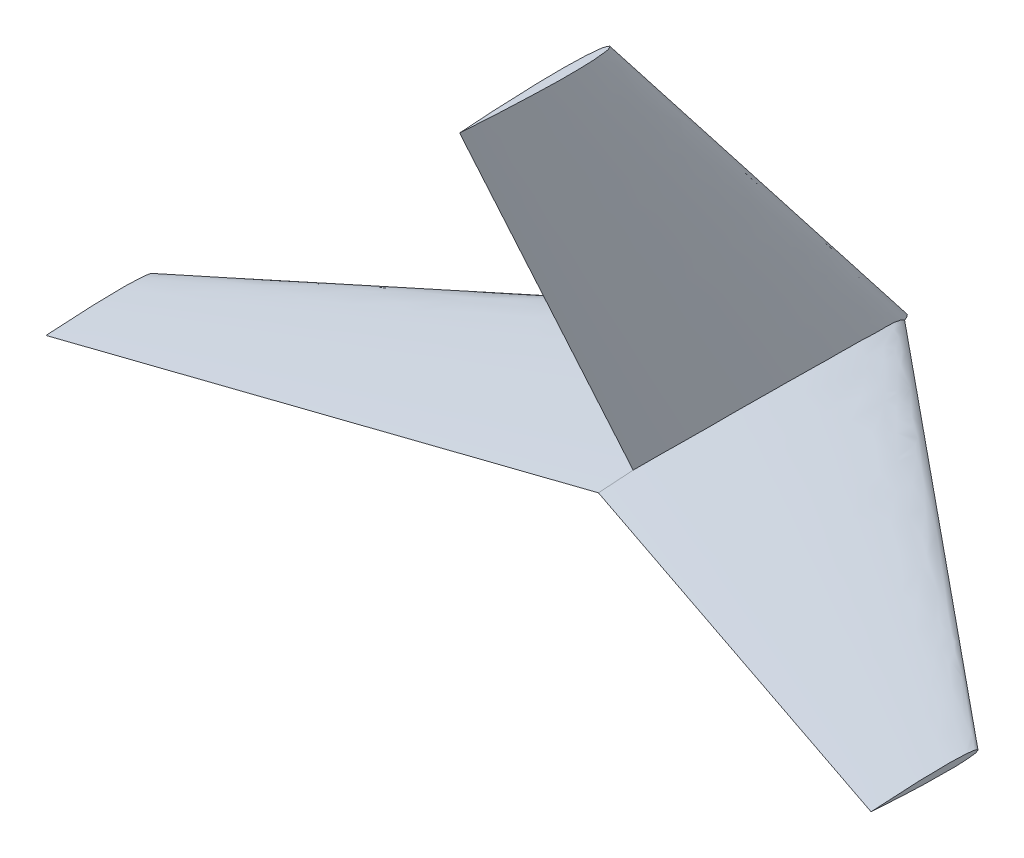
ISO-10303-21;
HEADER;
FILE_DESCRIPTION(('STEP AP214'),'2;1');
FILE_NAME('part.step','',(''),(''),'','','');
FILE_SCHEMA(('AUTOMOTIVE_DESIGN { 1 0 10303 214 1 1 1 1 }'));
ENDSEC;
DATA;
#1=APPLICATION_CONTEXT('core data for automotive mechanical design processes');
#2=APPLICATION_PROTOCOL_DEFINITION('international standard','automotive_design',2000,#1);
#3=PRODUCT_CONTEXT('',#1,'mechanical');
#4=PRODUCT('Part','Part','',(#3));
#5=PRODUCT_RELATED_PRODUCT_CATEGORY('part','',(#4));
#6=PRODUCT_DEFINITION_FORMATION('','',#4);
#7=PRODUCT_DEFINITION_CONTEXT('part definition',#1,'design');
#8=PRODUCT_DEFINITION('design','',#6,#7);
#9=PRODUCT_DEFINITION_SHAPE('','',#8);
#10=(LENGTH_UNIT() NAMED_UNIT(*) SI_UNIT(.MILLI.,.METRE.));
#11=(NAMED_UNIT(*) PLANE_ANGLE_UNIT() SI_UNIT($,.RADIAN.));
#12=(NAMED_UNIT(*) SI_UNIT($,.STERADIAN.) SOLID_ANGLE_UNIT());
#13=UNCERTAINTY_MEASURE_WITH_UNIT(LENGTH_MEASURE(1.E-05),#10,'distance_accuracy_value','');
#14=(GEOMETRIC_REPRESENTATION_CONTEXT(3) GLOBAL_UNCERTAINTY_ASSIGNED_CONTEXT((#13)) GLOBAL_UNIT_ASSIGNED_CONTEXT((#10,
#11,#12)) REPRESENTATION_CONTEXT('',''));
#15=CARTESIAN_POINT('',(0.,0.,0.));
#16=DIRECTION('',(0.,0.,1.));
#17=DIRECTION('',(1.,0.,0.));
#18=AXIS2_PLACEMENT_3D('',#15,#16,#17);
#19=CARTESIAN_POINT('',(143.375916228121,0.,2614.62639988449));
#20=DIRECTION('',(0.,1.,0.));
#21=DIRECTION('',(0.,0.,1.));
#22=AXIS2_PLACEMENT_3D('',#19,#20,#21);
#23=PLANE('',#22);
#24=CARTESIAN_POINT('',(0.,0.,-67.1064837405098));
#25=CARTESIAN_POINT('',(38.8622107668066,0.,-24.8353338561813));
#26=CARTESIAN_POINT('',(76.3641555154968,0.,58.9592027991834));
#27=CARTESIAN_POINT('',(92.8431742237743,0.,160.205111351248));
#28=CARTESIAN_POINT('',(106.469147072584,0.,251.886235017498));
#29=CARTESIAN_POINT('',(113.816795315117,0.,308.638421659881));
#30=CARTESIAN_POINT('',(121.970206556132,0.,390.595539143447));
#31=CARTESIAN_POINT('',(125.035449194138,0.,430.17457734353));
#32=CARTESIAN_POINT('',(134.952244473029,0.,562.270755544533));
#33=CARTESIAN_POINT('',(142.07101775481,0.,666.149477159571));
#34=CARTESIAN_POINT('',(151.076367101239,0.,845.00605157845));
#35=CARTESIAN_POINT('',(154.115535490917,0.,929.068005432931));
#36=CARTESIAN_POINT('',(161.252208187403,0.,1185.55672340736));
#37=CARTESIAN_POINT('',(162.798728028638,0.,1366.75073446423));
#38=CARTESIAN_POINT('',(161.967505450159,0.,1905.5600640858));
#39=CARTESIAN_POINT('',(150.288221064404,0.,2444.8644097356));
#40=CARTESIAN_POINT('',(105.609227510775,0.,3701.48037922139));
#41=CARTESIAN_POINT('',(53.3955572406963,0.,4598.67152688222));
#42=CARTESIAN_POINT('',(0.,0.,5315.73791340827));
#43=B_SPLINE_CURVE_WITH_KNOTS('',3,(#24,#25,#26,#27,#28,#29,#30,#31,#32,#33,#34,#35,#36,#37,#38,
#39,#40,#41,#42),.UNSPECIFIED.,.F.,.F.,(4,1,1,1,1,1,1,1,1,1,1,1,1,1,1,1,4),(0.,
0.0297058083328104,0.0510978464013305,0.0565096885743449,0.0809910879672366,0.0828808325251551,
0.102210307338613,0.102991506427505,0.156309200171479,0.159955320691823,0.20230384136123,
0.202945881367145,0.3022274459203,0.302769745085962,0.501714656703684,0.601305632204494,1.),.UNSPECIFIED.);
#44=CARTESIAN_POINT('',(0.,0.,5315.73791340827));
#45=VERTEX_POINT('',#44);
#46=CARTESIAN_POINT('',(0.,0.,-67.1064837405098));
#47=VERTEX_POINT('',#46);
#48=EDGE_CURVE('E108',#45,#47,#43,.F.);
#49=ORIENTED_EDGE('',*,*,#48,.F.);
#50=CARTESIAN_POINT('',(0.,0.,5315.73791340827));
#51=CARTESIAN_POINT('',(-53.3955572406954,0.,4598.67152688222));
#52=CARTESIAN_POINT('',(-105.609227510774,0.,3701.48037922139));
#53=CARTESIAN_POINT('',(-150.288221064403,0.,2444.8644097356));
#54=CARTESIAN_POINT('',(-161.967505450158,0.,1905.5600640858));
#55=CARTESIAN_POINT('',(-162.798728028637,0.,1366.75073446423));
#56=CARTESIAN_POINT('',(-161.252208187403,0.,1185.55672340736));
#57=CARTESIAN_POINT('',(-154.115535490916,0.,929.068005432931));
#58=CARTESIAN_POINT('',(-151.076367101239,0.,845.00605157845));
#59=CARTESIAN_POINT('',(-142.071017754809,0.,666.149477159571));
#60=CARTESIAN_POINT('',(-134.952244473029,0.,562.270755544533));
#61=CARTESIAN_POINT('',(-125.035449194138,0.,430.17457734353));
#62=CARTESIAN_POINT('',(-121.970206556132,0.,390.595539143447));
#63=CARTESIAN_POINT('',(-113.816795315117,0.,308.638421659881));
#64=CARTESIAN_POINT('',(-106.469147072584,0.,251.886235017498));
#65=CARTESIAN_POINT('',(-92.8431742237743,0.,160.205111351248));
#66=CARTESIAN_POINT('',(-76.3641555154968,0.,58.9592027991834));
#67=CARTESIAN_POINT('',(-38.8622107668066,0.,-24.8353338561813));
#68=CARTESIAN_POINT('',(0.,0.,-67.1064837405098));
#69=B_SPLINE_CURVE_WITH_KNOTS('',3,(#50,#51,#52,#53,#54,#55,#56,#57,#58,#59,#60,#61,#62,#63,#64,
#65,#66,#67,#68),.UNSPECIFIED.,.F.,.F.,(4,1,1,1,1,1,1,1,1,1,1,1,1,1,1,1,4),(0.,
0.398694367795506,0.498285343296316,0.697230254914038,0.6977725540797,0.797054118632855,
0.79769615863877,0.840044679308177,0.843690799828521,0.897008493572495,0.897789692661387,
0.917119167474845,0.919008912032763,0.943490311425655,0.948902153598669,0.97029419166719,1.),.UNSPECIFIED.);
#70=EDGE_CURVE('E72',#47,#45,#69,.F.);
#71=ORIENTED_EDGE('',*,*,#70,.F.);
#72=EDGE_LOOP('',(#49,#71));
#73=FACE_BOUND('',#72,.T.);
#74=ADVANCED_FACE('F69',(#73),#23,.F.);
#75=CARTESIAN_POINT('',(-77.5658627000602,7509.06793402254,7271.59948119024));
#76=DIRECTION('',(0.,1.,0.));
#77=DIRECTION('',(-1.,0.,0.));
#78=AXIS2_PLACEMENT_3D('',#75,#76,#77);
#79=PLANE('',#78);
#80=CARTESIAN_POINT('',(4.44089209850063E-13,7509.06793402254,8756.93390170189));
#81=CARTESIAN_POINT('',(-32.5278923048957,7509.06793402254,8362.74904107721));
#82=CARTESIAN_POINT('',(-53.5054302796314,7509.06793402254,7869.24601761998));
#83=CARTESIAN_POINT('',(-81.9587334886633,7509.06793402254,7178.2420495364));
#84=CARTESIAN_POINT('',(-89.4748256008597,7509.06793402254,6881.73853737439));
#85=CARTESIAN_POINT('',(-87.9088036493534,7509.06793402254,6585.50896778083));
#86=CARTESIAN_POINT('',(-85.8628578217169,7509.06793402254,6485.8915527308));
#87=CARTESIAN_POINT('',(-82.778944776583,7509.06793402254,6344.85467670777));
#88=CARTESIAN_POINT('',(-81.726749648483,7509.06793402254,6298.62780580161));
#89=CARTESIAN_POINT('',(-77.1417301573889,7509.06793402254,6200.22127169308));
#90=CARTESIAN_POINT('',(-72.8749543345173,7509.06793402254,6143.0388121138));
#91=CARTESIAN_POINT('',(-67.0596576122944,7509.06793402254,6070.58157866028));
#92=CARTESIAN_POINT('',(-65.2561569890398,7509.06793402254,6048.89513210601));
#93=CARTESIAN_POINT('',(-60.4140665043991,7509.06793402254,6003.59957020046));
#94=CARTESIAN_POINT('',(-56.1971944610726,7509.06793402254,5971.97348351821));
#95=CARTESIAN_POINT('',(-50.1539003960239,7509.06793402254,5922.81752827763));
#96=CARTESIAN_POINT('',(-41.8895400672121,7509.06793402254,5869.01802656686));
#97=CARTESIAN_POINT('',(-15.5863620162666,7509.06793402254,5810.84776595802));
#98=CARTESIAN_POINT('',(0.,7509.06793402254,5796.36948327006));
#99=B_SPLINE_CURVE_WITH_KNOTS('',3,(#80,#81,#82,#83,#84,#85,#86,#87,#88,#89,#90,#91,#92,#93,#94,
#95,#96,#97,#98),.UNSPECIFIED.,.F.,.F.,(4,1,1,1,1,1,1,1,1,1,1,1,1,1,1,1,4),(0.,
0.398694367795506,0.498285343296316,0.697230254914038,0.6977725540797,0.797054118632855,
0.79769615863877,0.840044679308177,0.843690799828521,0.897008493572495,0.897789692661387,
0.917119167474845,0.919008912032763,0.943490311425655,0.948902153598669,0.97029419166719,1.),.UNSPECIFIED.);
#100=CARTESIAN_POINT('',(4.44089209850063E-13,7509.06793402254,8756.93390170189));
#101=VERTEX_POINT('',#100);
#102=CARTESIAN_POINT('',(0.,7509.06793402254,5796.36948327006));
#103=VERTEX_POINT('',#102);
#104=EDGE_CURVE('E14',#101,#103,#99,.T.);
#105=ORIENTED_EDGE('',*,*,#104,.F.);
#106=CARTESIAN_POINT('',(0.,7509.06793402254,5796.36948327006));
#107=CARTESIAN_POINT('',(15.5863620162666,7509.06793402254,5810.84776595802));
#108=CARTESIAN_POINT('',(41.8895400672126,7509.06793402254,5869.01802656685));
#109=CARTESIAN_POINT('',(50.1539003960239,7509.06793402254,5922.81752827763));
#110=CARTESIAN_POINT('',(56.1971944610726,7509.06793402254,5971.97348351821));
#111=CARTESIAN_POINT('',(60.4140665043991,7509.06793402254,6003.59957020046));
#112=CARTESIAN_POINT('',(65.2561569890402,7509.06793402254,6048.89513210601));
#113=CARTESIAN_POINT('',(67.0596576122944,7509.06793402254,6070.58157866028));
#114=CARTESIAN_POINT('',(72.8749543345177,7509.06793402254,6143.0388121138));
#115=CARTESIAN_POINT('',(77.1417301573893,7509.06793402254,6200.22127169308));
#116=CARTESIAN_POINT('',(81.7267496484835,7509.06793402254,6298.62780580161));
#117=CARTESIAN_POINT('',(82.778944776583,7509.06793402254,6344.85467670776));
#118=CARTESIAN_POINT('',(85.8628578217169,7509.06793402254,6485.8915527308));
#119=CARTESIAN_POINT('',(87.9088036493538,7509.06793402254,6585.50896778083));
#120=CARTESIAN_POINT('',(89.4748256008602,7509.06793402254,6881.73853737439));
#121=CARTESIAN_POINT('',(81.9587334886642,7509.06793402254,7178.2420495364));
#122=CARTESIAN_POINT('',(53.5054302796318,7509.06793402254,7869.24601761998));
#123=CARTESIAN_POINT('',(32.5278923048962,7509.06793402254,8362.74904107721));
#124=CARTESIAN_POINT('',(4.44089209850063E-13,7509.06793402254,8756.93390170189));
#125=B_SPLINE_CURVE_WITH_KNOTS('',3,(#106,#107,#108,#109,#110,#111,#112,#113,#114,#115,#116,
#117,#118,#119,#120,#121,#122,#123,#124),.UNSPECIFIED.,.F.,.F.,(4,1,1,1,1,1,1,1,1,1,1,1,1,1,1,1,
4),(0.,0.0297058083328104,0.0510978464013305,0.0565096885743449,0.0809910879672366,
0.0828808325251551,0.102210307338613,0.102991506427505,0.156309200171479,0.159955320691823,
0.20230384136123,0.202945881367145,0.3022274459203,0.302769745085962,0.501714656703684,
0.601305632204494,1.),.UNSPECIFIED.);
#126=EDGE_CURVE('E94',#103,#101,#125,.T.);
#127=ORIENTED_EDGE('',*,*,#126,.F.);
#128=EDGE_LOOP('',(#105,#127));
#129=FACE_BOUND('',#128,.T.);
#130=ADVANCED_FACE('F95',(#129),#79,.T.);
#131=CARTESIAN_POINT('',(4.44089209850063E-13,7509.06793402254,8756.93390170189));
#132=CARTESIAN_POINT('',(0.,0.,5315.73791340827));
#133=CARTESIAN_POINT('',(-32.5278923048957,7509.06793402254,8362.74904107721));
#134=CARTESIAN_POINT('',(-53.3955572406954,0.,4598.67152688222));
#135=CARTESIAN_POINT('',(-53.5054302796314,7509.06793402254,7869.24601761998));
#136=CARTESIAN_POINT('',(-105.609227510774,0.,3701.48037922139));
#137=CARTESIAN_POINT('',(-81.9587334886633,7509.06793402254,7178.2420495364));
#138=CARTESIAN_POINT('',(-150.288221064403,0.,2444.8644097356));
#139=CARTESIAN_POINT('',(-89.4748256008597,7509.06793402254,6881.73853737439));
#140=CARTESIAN_POINT('',(-161.967505450158,0.,1905.5600640858));
#141=CARTESIAN_POINT('',(-87.9088036493534,7509.06793402254,6585.50896778083));
#142=CARTESIAN_POINT('',(-162.798728028637,0.,1366.75073446423));
#143=CARTESIAN_POINT('',(-85.8628578217169,7509.06793402254,6485.8915527308));
#144=CARTESIAN_POINT('',(-161.252208187403,0.,1185.55672340736));
#145=CARTESIAN_POINT('',(-82.778944776583,7509.06793402254,6344.85467670777));
#146=CARTESIAN_POINT('',(-154.115535490916,0.,929.068005432931));
#147=CARTESIAN_POINT('',(-81.726749648483,7509.06793402254,6298.62780580161));
#148=CARTESIAN_POINT('',(-151.076367101239,0.,845.00605157845));
#149=CARTESIAN_POINT('',(-77.1417301573889,7509.06793402254,6200.22127169308));
#150=CARTESIAN_POINT('',(-142.071017754809,0.,666.149477159571));
#151=CARTESIAN_POINT('',(-72.8749543345173,7509.06793402254,6143.0388121138));
#152=CARTESIAN_POINT('',(-134.952244473029,0.,562.270755544533));
#153=CARTESIAN_POINT('',(-67.0596576122944,7509.06793402254,6070.58157866028));
#154=CARTESIAN_POINT('',(-125.035449194138,0.,430.17457734353));
#155=CARTESIAN_POINT('',(-65.2561569890398,7509.06793402254,6048.89513210601));
#156=CARTESIAN_POINT('',(-121.970206556132,0.,390.595539143447));
#157=CARTESIAN_POINT('',(-60.4140665043991,7509.06793402254,6003.59957020046));
#158=CARTESIAN_POINT('',(-113.816795315117,0.,308.638421659881));
#159=CARTESIAN_POINT('',(-56.1971944610726,7509.06793402254,5971.97348351821));
#160=CARTESIAN_POINT('',(-106.469147072584,0.,251.886235017498));
#161=CARTESIAN_POINT('',(-50.1539003960239,7509.06793402254,5922.81752827763));
#162=CARTESIAN_POINT('',(-92.8431742237743,0.,160.205111351248));
#163=CARTESIAN_POINT('',(-41.8895400672121,7509.06793402254,5869.01802656686));
#164=CARTESIAN_POINT('',(-76.3641555154968,0.,58.9592027991834));
#165=CARTESIAN_POINT('',(-15.5863620162666,7509.06793402254,5810.84776595802));
#166=CARTESIAN_POINT('',(-38.8622107668066,0.,-24.8353338561813));
#167=CARTESIAN_POINT('',(0.,7509.06793402254,5796.36948327006));
#168=CARTESIAN_POINT('',(0.,0.,-67.1064837405098));
#169=B_SPLINE_SURFACE_WITH_KNOTS('',3,1,((#131,#132),(#133,#134),(#135,#136),(#137,#138),(#139,
#140),(#141,#142),(#143,#144),(#145,#146),(#147,#148),(#149,#150),(#151,#152),(#153,#154),(#155,
#156),(#157,#158),(#159,#160),(#161,#162),(#163,#164),(#165,#166),(#167,#168)),.UNSPECIFIED.,
.F.,.F.,.F.,(4,1,1,1,1,1,1,1,1,1,1,1,1,1,1,1,4),(2,2),(0.,0.398694367795506,0.498285343296316,
0.697230254914038,0.6977725540797,0.797054118632855,0.79769615863877,0.840044679308177,
0.843690799828521,0.897008493572495,0.897789692661387,0.917119167474845,0.919008912032763,
0.943490311425655,0.948902153598669,0.97029419166719,1.),(0.,1.),.UNSPECIFIED.);
#170=DIRECTION('',(0.,0.788176268628742,0.615449567040609));
#171=VECTOR('',#170,1.);
#172=CARTESIAN_POINT('',(0.,3754.53396701127,2864.63149976478));
#173=LINE('',#172,#171);
#174=EDGE_CURVE('E106',#47,#103,#173,.T.);
#175=DIRECTION('',(0.,-0.909085921983997,-0.416608673038028));
#176=VECTOR('',#175,1.);
#177=CARTESIAN_POINT('',(0.,3754.53396701127,7036.33590755508));
#178=LINE('',#177,#176);
#179=EDGE_CURVE('E101',#101,#45,#178,.T.);
#180=ORIENTED_EDGE('',*,*,#104,.T.);
#181=ORIENTED_EDGE('',*,*,#174,.F.);
#182=ORIENTED_EDGE('',*,*,#70,.T.);
#183=ORIENTED_EDGE('',*,*,#179,.F.);
#184=EDGE_LOOP('',(#180,#181,#182,#183));
#185=FACE_BOUND('',#184,.T.);
#186=ADVANCED_FACE('F105',(#185),#169,.T.);
#187=CARTESIAN_POINT('',(0.,7509.06793402254,5796.36948327006));
#188=CARTESIAN_POINT('',(0.,0.,-67.1064837405098));
#189=CARTESIAN_POINT('',(15.5863620162666,7509.06793402254,5810.84776595802));
#190=CARTESIAN_POINT('',(38.8622107668066,0.,-24.8353338561813));
#191=CARTESIAN_POINT('',(41.8895400672126,7509.06793402254,5869.01802656685));
#192=CARTESIAN_POINT('',(76.3641555154968,0.,58.9592027991834));
#193=CARTESIAN_POINT('',(50.1539003960239,7509.06793402254,5922.81752827763));
#194=CARTESIAN_POINT('',(92.8431742237743,0.,160.205111351248));
#195=CARTESIAN_POINT('',(56.1971944610726,7509.06793402254,5971.97348351821));
#196=CARTESIAN_POINT('',(106.469147072584,0.,251.886235017498));
#197=CARTESIAN_POINT('',(60.4140665043991,7509.06793402254,6003.59957020046));
#198=CARTESIAN_POINT('',(113.816795315117,0.,308.638421659881));
#199=CARTESIAN_POINT('',(65.2561569890402,7509.06793402254,6048.89513210601));
#200=CARTESIAN_POINT('',(121.970206556132,0.,390.595539143447));
#201=CARTESIAN_POINT('',(67.0596576122944,7509.06793402254,6070.58157866028));
#202=CARTESIAN_POINT('',(125.035449194138,0.,430.17457734353));
#203=CARTESIAN_POINT('',(72.8749543345177,7509.06793402254,6143.0388121138));
#204=CARTESIAN_POINT('',(134.952244473029,0.,562.270755544533));
#205=CARTESIAN_POINT('',(77.1417301573893,7509.06793402254,6200.22127169308));
#206=CARTESIAN_POINT('',(142.07101775481,0.,666.149477159571));
#207=CARTESIAN_POINT('',(81.7267496484835,7509.06793402254,6298.62780580161));
#208=CARTESIAN_POINT('',(151.076367101239,0.,845.00605157845));
#209=CARTESIAN_POINT('',(82.778944776583,7509.06793402254,6344.85467670776));
#210=CARTESIAN_POINT('',(154.115535490917,0.,929.068005432931));
#211=CARTESIAN_POINT('',(85.8628578217169,7509.06793402254,6485.8915527308));
#212=CARTESIAN_POINT('',(161.252208187403,0.,1185.55672340736));
#213=CARTESIAN_POINT('',(87.9088036493538,7509.06793402254,6585.50896778083));
#214=CARTESIAN_POINT('',(162.798728028638,0.,1366.75073446423));
#215=CARTESIAN_POINT('',(89.4748256008602,7509.06793402254,6881.73853737439));
#216=CARTESIAN_POINT('',(161.967505450159,0.,1905.5600640858));
#217=CARTESIAN_POINT('',(81.9587334886642,7509.06793402254,7178.2420495364));
#218=CARTESIAN_POINT('',(150.288221064404,0.,2444.8644097356));
#219=CARTESIAN_POINT('',(53.5054302796318,7509.06793402254,7869.24601761998));
#220=CARTESIAN_POINT('',(105.609227510775,0.,3701.48037922139));
#221=CARTESIAN_POINT('',(32.5278923048962,7509.06793402254,8362.74904107721));
#222=CARTESIAN_POINT('',(53.3955572406963,0.,4598.67152688222));
#223=CARTESIAN_POINT('',(4.44089209850063E-13,7509.06793402254,8756.93390170189));
#224=CARTESIAN_POINT('',(0.,0.,5315.73791340827));
#225=B_SPLINE_SURFACE_WITH_KNOTS('',3,1,((#187,#188),(#189,#190),(#191,#192),(#193,#194),(#195,
#196),(#197,#198),(#199,#200),(#201,#202),(#203,#204),(#205,#206),(#207,#208),(#209,#210),(#211,
#212),(#213,#214),(#215,#216),(#217,#218),(#219,#220),(#221,#222),(#223,#224)),.UNSPECIFIED.,
.F.,.F.,.F.,(4,1,1,1,1,1,1,1,1,1,1,1,1,1,1,1,4),(2,2),(0.,0.0297058083328104,0.0510978464013305,
0.0565096885743449,0.0809910879672366,0.0828808325251551,0.102210307338613,0.102991506427505,
0.156309200171479,0.159955320691823,0.20230384136123,0.202945881367145,0.3022274459203,
0.302769745085962,0.501714656703684,0.601305632204494,1.),(0.,1.),.UNSPECIFIED.);
#226=ORIENTED_EDGE('',*,*,#126,.T.);
#227=ORIENTED_EDGE('',*,*,#179,.T.);
#228=ORIENTED_EDGE('',*,*,#48,.T.);
#229=ORIENTED_EDGE('',*,*,#174,.T.);
#230=EDGE_LOOP('',(#226,#227,#228,#229));
#231=FACE_BOUND('',#230,.T.);
#232=ADVANCED_FACE('F107',(#231),#225,.T.);
#233=CLOSED_SHELL('',(#74,#130,#186,#232));
#234=MANIFOLD_SOLID_BREP('B2',#233);
#235=CARTESIAN_POINT('',(8129.32474719149,54.9994394448174,7720.83097549307));
#236=DIRECTION('',(-1.,0.,0.));
#237=DIRECTION('',(0.,0.,-1.));
#238=AXIS2_PLACEMENT_3D('',#235,#236,#237);
#239=PLANE('',#238);
#240=CARTESIAN_POINT('',(8129.32474719149,-4.44089209850063E-13,8778.34701145353));
#241=CARTESIAN_POINT('',(8129.32474719149,13.4689535346464,8567.79107372927));
#242=CARTESIAN_POINT('',(8129.32474719149,35.7745448107063,8216.72224519072));
#243=CARTESIAN_POINT('',(8129.32474719149,50.8000343743578,7865.22228500027));
#244=CARTESIAN_POINT('',(8129.32474719149,58.9672063252578,7584.43475676211));
#245=CARTESIAN_POINT('',(8129.32474719149,61.1467978209106,7443.692333661));
#246=CARTESIAN_POINT('',(8129.32474719149,62.2292931475541,7232.92916361684));
#247=CARTESIAN_POINT('',(8129.32474719149,62.2128927212469,7162.30727948896));
#248=CARTESIAN_POINT('',(8129.32474719149,59.0292367567256,7059.23223622224));
#249=CARTESIAN_POINT('',(8129.32474719149,57.3568159019948,7022.34378664667));
#250=CARTESIAN_POINT('',(8129.32474719149,53.4838626971883,6951.9195742344));
#251=CARTESIAN_POINT('',(8129.32474719149,51.0268210130049,6914.31299621902));
#252=CARTESIAN_POINT('',(8129.32474719149,47.1229848342181,6864.58810519034));
#253=CARTESIAN_POINT('',(8129.32474719149,45.6806839170984,6847.61853535539));
#254=CARTESIAN_POINT('',(8129.32474719149,42.0327102210813,6814.79063567584));
#255=CARTESIAN_POINT('',(8129.32474719149,39.4990681574887,6796.55240807656));
#256=CARTESIAN_POINT('',(8129.32474719149,32.2228985029138,6740.84151167535));
#257=CARTESIAN_POINT('',(8129.32474719149,27.9357117117254,6700.23471062862));
#258=CARTESIAN_POINT('',(8129.32474719149,0.,6670.7442992187));
#259=B_SPLINE_CURVE_WITH_KNOTS('',3,(#240,#241,#242,#243,#244,#245,#246,#247,#248,#249,#250,
#251,#252,#253,#254,#255,#256,#257,#258),.UNSPECIFIED.,.F.,.F.,(4,1,1,1,1,1,1,1,1,1,1,1,1,1,1,1,
4),(0.,0.298931815970666,0.498152968932551,0.498299211220126,0.696834066796413,
0.697522121171649,0.796796462208503,0.796844070583475,0.843589068570306,0.849087559843308,
0.896763932817385,0.896989321780881,0.919683005075993,0.920855221312245,0.943853286653914,
0.94587432595104,1.),.UNSPECIFIED.);
#260=CARTESIAN_POINT('',(8129.32474719149,0.,6670.7442992187));
#261=VERTEX_POINT('',#260);
#262=CARTESIAN_POINT('',(8129.32474719149,-4.44089209850063E-13,8778.34701145353));
#263=VERTEX_POINT('',#262);
#264=EDGE_CURVE('E271',#261,#263,#259,.F.);
#265=ORIENTED_EDGE('',*,*,#264,.T.);
#266=CARTESIAN_POINT('',(8129.32474719149,0.,6670.7442992187));
#267=CARTESIAN_POINT('',(8129.32474719149,-27.9357117117254,6700.23471062863));
#268=CARTESIAN_POINT('',(8129.32474719149,-32.2228985029143,6740.84151167535));
#269=CARTESIAN_POINT('',(8129.32474719149,-39.4990681574892,6796.55240807656));
#270=CARTESIAN_POINT('',(8129.32474719149,-42.0327102210818,6814.79063567584));
#271=CARTESIAN_POINT('',(8129.32474719149,-45.6806839170989,6847.61853535539));
#272=CARTESIAN_POINT('',(8129.32474719149,-47.1229848342185,6864.58810519033));
#273=CARTESIAN_POINT('',(8129.32474719149,-51.0268210130054,6914.31299621902));
#274=CARTESIAN_POINT('',(8129.32474719149,-53.4838626971883,6951.9195742344));
#275=CARTESIAN_POINT('',(8129.32474719149,-57.3568159019953,7022.34378664667));
#276=CARTESIAN_POINT('',(8129.32474719149,-59.029236756726,7059.23223622224));
#277=CARTESIAN_POINT('',(8129.32474719149,-62.2128927212469,7162.30727948896));
#278=CARTESIAN_POINT('',(8129.32474719149,-62.2292931475545,7232.92916361684));
#279=CARTESIAN_POINT('',(8129.32474719149,-61.146797820911,7443.69233366099));
#280=CARTESIAN_POINT('',(8129.32474719149,-58.9672063252586,7584.43475676211));
#281=CARTESIAN_POINT('',(8129.32474719149,-50.8000343743582,7865.22228500027));
#282=CARTESIAN_POINT('',(8129.32474719149,-35.7745448107067,8216.72224519072));
#283=CARTESIAN_POINT('',(8129.32474719149,-13.4689535346473,8567.79107372928));
#284=CARTESIAN_POINT('',(8129.32474719149,-4.44089209850063E-13,8778.34701145353));
#285=B_SPLINE_CURVE_WITH_KNOTS('',3,(#266,#267,#268,#269,#270,#271,#272,#273,#274,#275,#276,
#277,#278,#279,#280,#281,#282,#283,#284),.UNSPECIFIED.,.F.,.F.,(4,1,1,1,1,1,1,1,1,1,1,1,1,1,1,1,
4),(0.,0.0541256740489601,0.0561467133460857,0.0791447786877554,0.0803169949240068,
0.103010678219119,0.103236067182615,0.150912440156692,0.156410931429694,0.203155929416525,
0.203203537791497,0.302477878828351,0.303165933203587,0.501700788779874,0.501847031067449,
0.701068184029334,1.),.UNSPECIFIED.);
#286=EDGE_CURVE('E302',#263,#261,#285,.F.);
#287=ORIENTED_EDGE('',*,*,#286,.T.);
#288=EDGE_LOOP('',(#265,#287));
#289=FACE_BOUND('',#288,.T.);
#290=ADVANCED_FACE('F268',(#289),#239,.F.);
#291=CARTESIAN_POINT('',(-8129.32474719149,54.9994394448174,7720.83097549307));
#292=DIRECTION('',(1.,0.,0.));
#293=DIRECTION('',(0.,0.,-1.));
#294=AXIS2_PLACEMENT_3D('',#291,#292,#293);
#295=PLANE('',#294);
#296=CARTESIAN_POINT('',(-8129.32474719149,-4.44089209850063E-13,8778.34701145353));
#297=CARTESIAN_POINT('',(-8129.32474719149,13.4689535346464,8567.79107372927));
#298=CARTESIAN_POINT('',(-8129.32474719149,35.7745448107063,8216.72224519072));
#299=CARTESIAN_POINT('',(-8129.32474719149,50.8000343743578,7865.22228500027));
#300=CARTESIAN_POINT('',(-8129.32474719149,58.9672063252578,7584.43475676211));
#301=CARTESIAN_POINT('',(-8129.32474719149,61.1467978209106,7443.692333661));
#302=CARTESIAN_POINT('',(-8129.32474719149,62.2292931475541,7232.92916361684));
#303=CARTESIAN_POINT('',(-8129.32474719149,62.2128927212469,7162.30727948896));
#304=CARTESIAN_POINT('',(-8129.32474719149,59.0292367567256,7059.23223622224));
#305=CARTESIAN_POINT('',(-8129.32474719149,57.3568159019948,7022.34378664667));
#306=CARTESIAN_POINT('',(-8129.32474719149,53.4838626971883,6951.9195742344));
#307=CARTESIAN_POINT('',(-8129.32474719149,51.0268210130049,6914.31299621902));
#308=CARTESIAN_POINT('',(-8129.32474719149,47.1229848342181,6864.58810519034));
#309=CARTESIAN_POINT('',(-8129.32474719149,45.6806839170984,6847.61853535539));
#310=CARTESIAN_POINT('',(-8129.32474719149,42.0327102210813,6814.79063567584));
#311=CARTESIAN_POINT('',(-8129.32474719149,39.4990681574887,6796.55240807656));
#312=CARTESIAN_POINT('',(-8129.32474719149,32.2228985029138,6740.84151167535));
#313=CARTESIAN_POINT('',(-8129.32474719149,27.9357117117254,6700.23471062862));
#314=CARTESIAN_POINT('',(-8129.32474719149,0.,6670.7442992187));
#315=B_SPLINE_CURVE_WITH_KNOTS('',3,(#296,#297,#298,#299,#300,#301,#302,#303,#304,#305,#306,
#307,#308,#309,#310,#311,#312,#313,#314),.UNSPECIFIED.,.F.,.F.,(4,1,1,1,1,1,1,1,1,1,1,1,1,1,1,1,
4),(0.,0.298931815970666,0.498152968932551,0.498299211220126,0.696834066796413,
0.697522121171649,0.796796462208503,0.796844070583475,0.843589068570306,0.849087559843308,
0.896763932817385,0.896989321780881,0.919683005075993,0.920855221312245,0.943853286653914,
0.94587432595104,1.),.UNSPECIFIED.);
#316=CARTESIAN_POINT('',(-8129.32474719149,0.,6670.7442992187));
#317=VERTEX_POINT('',#316);
#318=CARTESIAN_POINT('',(-8129.32474719149,-4.44089209850063E-13,8778.34701145353));
#319=VERTEX_POINT('',#318);
#320=EDGE_CURVE('E280',#317,#319,#315,.F.);
#321=ORIENTED_EDGE('',*,*,#320,.F.);
#322=CARTESIAN_POINT('',(-8129.32474719149,0.,6670.7442992187));
#323=CARTESIAN_POINT('',(-8129.32474719149,-27.9357117117254,6700.23471062863));
#324=CARTESIAN_POINT('',(-8129.32474719149,-32.2228985029143,6740.84151167535));
#325=CARTESIAN_POINT('',(-8129.32474719149,-39.4990681574892,6796.55240807656));
#326=CARTESIAN_POINT('',(-8129.32474719149,-42.0327102210818,6814.79063567584));
#327=CARTESIAN_POINT('',(-8129.32474719149,-45.6806839170989,6847.61853535539));
#328=CARTESIAN_POINT('',(-8129.32474719149,-47.1229848342185,6864.58810519033));
#329=CARTESIAN_POINT('',(-8129.32474719149,-51.0268210130054,6914.31299621902));
#330=CARTESIAN_POINT('',(-8129.32474719149,-53.4838626971883,6951.9195742344));
#331=CARTESIAN_POINT('',(-8129.32474719149,-57.3568159019953,7022.34378664667));
#332=CARTESIAN_POINT('',(-8129.32474719149,-59.029236756726,7059.23223622224));
#333=CARTESIAN_POINT('',(-8129.32474719149,-62.2128927212469,7162.30727948896));
#334=CARTESIAN_POINT('',(-8129.32474719149,-62.2292931475545,7232.92916361684));
#335=CARTESIAN_POINT('',(-8129.32474719149,-61.146797820911,7443.69233366099));
#336=CARTESIAN_POINT('',(-8129.32474719149,-58.9672063252586,7584.43475676211));
#337=CARTESIAN_POINT('',(-8129.32474719149,-50.8000343743582,7865.22228500027));
#338=CARTESIAN_POINT('',(-8129.32474719149,-35.7745448107067,8216.72224519072));
#339=CARTESIAN_POINT('',(-8129.32474719149,-13.4689535346473,8567.79107372928));
#340=CARTESIAN_POINT('',(-8129.32474719149,-4.44089209850063E-13,8778.34701145353));
#341=B_SPLINE_CURVE_WITH_KNOTS('',3,(#322,#323,#324,#325,#326,#327,#328,#329,#330,#331,#332,
#333,#334,#335,#336,#337,#338,#339,#340),.UNSPECIFIED.,.F.,.F.,(4,1,1,1,1,1,1,1,1,1,1,1,1,1,1,1,
4),(0.,0.0541256740489601,0.0561467133460857,0.0791447786877554,0.0803169949240068,
0.103010678219119,0.103236067182615,0.150912440156692,0.156410931429694,0.203155929416525,
0.203203537791497,0.302477878828351,0.303165933203587,0.501700788779874,0.501847031067449,
0.701068184029334,1.),.UNSPECIFIED.);
#342=EDGE_CURVE('E344',#319,#317,#341,.F.);
#343=ORIENTED_EDGE('',*,*,#342,.F.);
#344=EDGE_LOOP('',(#321,#343));
#345=FACE_BOUND('',#344,.T.);
#346=ADVANCED_FACE('F398',(#345),#295,.F.);
#347=CARTESIAN_POINT('',(0.,-8.88178419700125E-13,6021.72203495666));
#348=CARTESIAN_POINT('',(8129.32474719149,-4.44089209850063E-13,8778.34701145353));
#349=CARTESIAN_POINT('',(0.,46.3690119108593,5420.44704454484));
#350=CARTESIAN_POINT('',(8129.32474719149,13.4689535346464,8567.79107372927));
#351=CARTESIAN_POINT('',(0.,106.271355176622,4417.13984206054));
#352=CARTESIAN_POINT('',(8129.32474719149,35.7745448107063,8216.72224519072));
#353=CARTESIAN_POINT('',(0.,148.898204057058,3412.8346681484));
#354=CARTESIAN_POINT('',(8129.32474719149,50.8000343743578,7865.22228500027));
#355=CARTESIAN_POINT('',(0.,174.937657660047,2610.43733759787));
#356=CARTESIAN_POINT('',(8129.32474719149,58.9672063252578,7584.43475676211));
#357=CARTESIAN_POINT('',(0.,183.989743287602,2208.17649578174));
#358=CARTESIAN_POINT('',(8129.32474719149,61.1467978209106,7443.692333661));
#359=CARTESIAN_POINT('',(0.,181.134739503504,1606.09656917311));
#360=CARTESIAN_POINT('',(8129.32474719149,62.2292931475541,7232.92916361684));
#361=CARTESIAN_POINT('',(0.,177.413749201689,1404.4047147438));
#362=CARTESIAN_POINT('',(8129.32474719149,62.2128927212469,7162.30727948896));
#363=CARTESIAN_POINT('',(0.,172.251479327948,1109.66966690718));
#364=CARTESIAN_POINT('',(8129.32474719149,59.0292367567256,7059.23223622224));
#365=CARTESIAN_POINT('',(0.,170.449693554909,1004.1293766448));
#366=CARTESIAN_POINT('',(8129.32474719149,57.3568159019948,7022.34378664667));
#367=CARTESIAN_POINT('',(0.,159.529123407822,802.932861879572));
#368=CARTESIAN_POINT('',(8129.32474719149,53.4838626971883,6951.9195742344));
#369=CARTESIAN_POINT('',(0.,149.140534915033,695.699066238626));
#370=CARTESIAN_POINT('',(8129.32474719149,51.0268210130049,6914.31299621902));
#371=CARTESIAN_POINT('',(0.,139.153184168193,553.525663161723));
#372=CARTESIAN_POINT('',(8129.32474719149,47.1229848342181,6864.58810519034));
#373=CARTESIAN_POINT('',(0.,136.363703716006,504.940315518095));
#374=CARTESIAN_POINT('',(8129.32474719149,45.6806839170984,6847.61853535539));
#375=CARTESIAN_POINT('',(0.,126.150435978666,411.095919100479));
#376=CARTESIAN_POINT('',(8129.32474719149,42.0327102210813,6814.79063567584));
#377=CARTESIAN_POINT('',(0.,117.886715822897,358.989027731464));
#378=CARTESIAN_POINT('',(8129.32474719149,39.4990681574887,6796.55240807656));
#379=CARTESIAN_POINT('',(0.,94.3559226564097,200.346514350576));
#380=CARTESIAN_POINT('',(8129.32474719149,32.2228985029138,6740.84151167535));
#381=CARTESIAN_POINT('',(0.,77.5009357479193,86.8556203485689));
#382=CARTESIAN_POINT('',(8129.32474719149,27.9357117117254,6700.23471062862));
#383=CARTESIAN_POINT('',(0.,0.,0.));
#384=CARTESIAN_POINT('',(8129.32474719149,0.,6670.7442992187));
#385=B_SPLINE_SURFACE_WITH_KNOTS('',3,1,((#347,#348),(#349,#350),(#351,#352),(#353,#354),(#355,
#356),(#357,#358),(#359,#360),(#361,#362),(#363,#364),(#365,#366),(#367,#368),(#369,#370),(#371,
#372),(#373,#374),(#375,#376),(#377,#378),(#379,#380),(#381,#382),(#383,#384)),.UNSPECIFIED.,
.F.,.F.,.F.,(4,1,1,1,1,1,1,1,1,1,1,1,1,1,1,1,4),(2,2),(0.,0.298931815970666,0.498152968932551,
0.498299211220126,0.696834066796413,0.697522121171649,0.796796462208503,0.796844070583475,
0.843589068570306,0.849087559843308,0.896763932817385,0.896989321780881,0.919683005075993,
0.920855221312245,0.943853286653914,0.94587432595104,1.),(0.,1.),.UNSPECIFIED.);
#386=CARTESIAN_POINT('',(0.,-8.88178419700125E-13,6021.72203495666));
#387=CARTESIAN_POINT('',(0.,46.3690119108593,5420.44704454484));
#388=CARTESIAN_POINT('',(0.,106.271355176622,4417.13984206054));
#389=CARTESIAN_POINT('',(0.,148.898204057058,3412.8346681484));
#390=CARTESIAN_POINT('',(0.,174.937657660047,2610.43733759787));
#391=CARTESIAN_POINT('',(0.,183.989743287602,2208.17649578174));
#392=CARTESIAN_POINT('',(0.,181.134739503504,1606.09656917311));
#393=CARTESIAN_POINT('',(0.,177.413749201689,1404.4047147438));
#394=CARTESIAN_POINT('',(0.,172.251479327948,1109.66966690718));
#395=CARTESIAN_POINT('',(0.,170.449693554909,1004.1293766448));
#396=CARTESIAN_POINT('',(0.,159.529123407822,802.932861879572));
#397=CARTESIAN_POINT('',(0.,149.140534915033,695.699066238626));
#398=CARTESIAN_POINT('',(0.,139.153184168193,553.525663161723));
#399=CARTESIAN_POINT('',(0.,136.363703716006,504.940315518095));
#400=CARTESIAN_POINT('',(0.,126.150435978666,411.095919100479));
#401=CARTESIAN_POINT('',(0.,117.886715822897,358.989027731464));
#402=CARTESIAN_POINT('',(0.,94.3559226564097,200.346514350576));
#403=CARTESIAN_POINT('',(0.,77.5009357479193,86.8556203485689));
#404=CARTESIAN_POINT('',(0.,0.,0.));
#405=B_SPLINE_CURVE_WITH_KNOTS('',3,(#386,#387,#388,#389,#390,#391,#392,#393,#394,#395,#396,
#397,#398,#399,#400,#401,#402,#403,#404),.UNSPECIFIED.,.F.,.F.,(4,1,1,1,1,1,1,1,1,1,1,1,1,1,1,1,
4),(0.,0.298931815970666,0.498152968932551,0.498299211220126,0.696834066796413,
0.697522121171649,0.796796462208503,0.796844070583475,0.843589068570306,0.849087559843308,
0.896763932817385,0.896989321780881,0.919683005075993,0.920855221312245,0.943853286653914,
0.94587432595104,1.),.UNSPECIFIED.);
#406=CARTESIAN_POINT('',(0.,-8.88178419700125E-13,6021.72203495666));
#407=VERTEX_POINT('',#406);
#408=CARTESIAN_POINT('',(0.,0.,0.));
#409=VERTEX_POINT('',#408);
#410=EDGE_CURVE('E219',#407,#409,#405,.T.);
#411=DIRECTION('',(0.947033228842652,0.,0.321135584244195));
#412=VECTOR('',#411,1.);
#413=CARTESIAN_POINT('',(4064.66237359574,-4.44089209850063E-13,7400.03452320509));
#414=LINE('',#413,#412);
#415=EDGE_CURVE('E307',#407,#263,#414,.T.);
#416=DIRECTION('',(-0.773048696155329,0.,-0.634346682321699));
#417=VECTOR('',#416,1.);
#418=CARTESIAN_POINT('',(4064.66237359574,0.,3335.37214960935));
#419=LINE('',#418,#417);
#420=EDGE_CURVE('E308',#261,#409,#419,.T.);
#421=ORIENTED_EDGE('',*,*,#410,.F.);
#422=ORIENTED_EDGE('',*,*,#415,.T.);
#423=ORIENTED_EDGE('',*,*,#264,.F.);
#424=ORIENTED_EDGE('',*,*,#420,.T.);
#425=EDGE_LOOP('',(#421,#422,#423,#424));
#426=FACE_BOUND('',#425,.T.);
#427=ADVANCED_FACE('F313',(#426),#385,.F.);
#428=CARTESIAN_POINT('',(0.,0.,0.));
#429=CARTESIAN_POINT('',(8129.32474719149,0.,6670.7442992187));
#430=CARTESIAN_POINT('',(0.,-77.5009357479193,86.8556203485689));
#431=CARTESIAN_POINT('',(8129.32474719149,-27.9357117117254,6700.23471062863));
#432=CARTESIAN_POINT('',(0.,-94.3559226564097,200.346514350576));
#433=CARTESIAN_POINT('',(8129.32474719149,-32.2228985029143,6740.84151167535));
#434=CARTESIAN_POINT('',(0.,-117.886715822898,358.989027731464));
#435=CARTESIAN_POINT('',(8129.32474719149,-39.4990681574892,6796.55240807656));
#436=CARTESIAN_POINT('',(0.,-126.150435978666,411.095919100479));
#437=CARTESIAN_POINT('',(8129.32474719149,-42.0327102210818,6814.79063567584));
#438=CARTESIAN_POINT('',(0.,-136.363703716006,504.940315518095));
#439=CARTESIAN_POINT('',(8129.32474719149,-45.6806839170989,6847.61853535539));
#440=CARTESIAN_POINT('',(0.,-139.153184168193,553.525663161725));
#441=CARTESIAN_POINT('',(8129.32474719149,-47.1229848342185,6864.58810519033));
#442=CARTESIAN_POINT('',(0.,-149.140534915033,695.699066238626));
#443=CARTESIAN_POINT('',(8129.32474719149,-51.0268210130054,6914.31299621902));
#444=CARTESIAN_POINT('',(0.,-159.529123407823,802.932861879572));
#445=CARTESIAN_POINT('',(8129.32474719149,-53.4838626971883,6951.9195742344));
#446=CARTESIAN_POINT('',(0.,-170.449693554909,1004.1293766448));
#447=CARTESIAN_POINT('',(8129.32474719149,-57.3568159019953,7022.34378664667));
#448=CARTESIAN_POINT('',(0.,-172.251479327948,1109.66966690718));
#449=CARTESIAN_POINT('',(8129.32474719149,-59.029236756726,7059.23223622224));
#450=CARTESIAN_POINT('',(0.,-177.413749201689,1404.4047147438));
#451=CARTESIAN_POINT('',(8129.32474719149,-62.2128927212469,7162.30727948896));
#452=CARTESIAN_POINT('',(0.,-181.134739503504,1606.09656917311));
#453=CARTESIAN_POINT('',(8129.32474719149,-62.2292931475545,7232.92916361684));
#454=CARTESIAN_POINT('',(0.,-183.989743287603,2208.17649578174));
#455=CARTESIAN_POINT('',(8129.32474719149,-61.146797820911,7443.69233366099));
#456=CARTESIAN_POINT('',(0.,-174.937657660048,2610.43733759787));
#457=CARTESIAN_POINT('',(8129.32474719149,-58.9672063252586,7584.43475676211));
#458=CARTESIAN_POINT('',(0.,-148.898204057059,3412.83466814841));
#459=CARTESIAN_POINT('',(8129.32474719149,-50.8000343743582,7865.22228500027));
#460=CARTESIAN_POINT('',(0.,-106.271355176623,4417.13984206055));
#461=CARTESIAN_POINT('',(8129.32474719149,-35.7745448107067,8216.72224519072));
#462=CARTESIAN_POINT('',(0.,-46.3690119108606,5420.44704454484));
#463=CARTESIAN_POINT('',(8129.32474719149,-13.4689535346473,8567.79107372928));
#464=CARTESIAN_POINT('',(0.,-8.88178419700125E-13,6021.72203495666));
#465=CARTESIAN_POINT('',(8129.32474719149,-4.44089209850063E-13,8778.34701145353));
#466=B_SPLINE_SURFACE_WITH_KNOTS('',3,1,((#428,#429),(#430,#431),(#432,#433),(#434,#435),(#436,
#437),(#438,#439),(#440,#441),(#442,#443),(#444,#445),(#446,#447),(#448,#449),(#450,#451),(#452,
#453),(#454,#455),(#456,#457),(#458,#459),(#460,#461),(#462,#463),(#464,#465)),.UNSPECIFIED.,
.F.,.F.,.F.,(4,1,1,1,1,1,1,1,1,1,1,1,1,1,1,1,4),(2,2),(0.,0.0541256740489601,0.0561467133460857,
0.0791447786877554,0.0803169949240068,0.103010678219119,0.103236067182615,0.150912440156692,
0.156410931429694,0.203155929416525,0.203203537791497,0.302477878828351,0.303165933203587,
0.501700788779874,0.501847031067449,0.701068184029334,1.),(0.,1.),.UNSPECIFIED.);
#467=CARTESIAN_POINT('',(0.,0.,0.));
#468=CARTESIAN_POINT('',(0.,-77.5009357479193,86.8556203485689));
#469=CARTESIAN_POINT('',(0.,-94.3559226564097,200.346514350576));
#470=CARTESIAN_POINT('',(0.,-117.886715822898,358.989027731464));
#471=CARTESIAN_POINT('',(0.,-126.150435978666,411.095919100479));
#472=CARTESIAN_POINT('',(0.,-136.363703716006,504.940315518095));
#473=CARTESIAN_POINT('',(0.,-139.153184168193,553.525663161725));
#474=CARTESIAN_POINT('',(0.,-149.140534915033,695.699066238626));
#475=CARTESIAN_POINT('',(0.,-159.529123407823,802.932861879572));
#476=CARTESIAN_POINT('',(0.,-170.449693554909,1004.1293766448));
#477=CARTESIAN_POINT('',(0.,-172.251479327948,1109.66966690718));
#478=CARTESIAN_POINT('',(0.,-177.413749201689,1404.4047147438));
#479=CARTESIAN_POINT('',(0.,-181.134739503504,1606.09656917311));
#480=CARTESIAN_POINT('',(0.,-183.989743287603,2208.17649578174));
#481=CARTESIAN_POINT('',(0.,-174.937657660048,2610.43733759787));
#482=CARTESIAN_POINT('',(0.,-148.898204057059,3412.83466814841));
#483=CARTESIAN_POINT('',(0.,-106.271355176623,4417.13984206055));
#484=CARTESIAN_POINT('',(0.,-46.3690119108606,5420.44704454484));
#485=CARTESIAN_POINT('',(0.,-8.88178419700125E-13,6021.72203495666));
#486=B_SPLINE_CURVE_WITH_KNOTS('',3,(#467,#468,#469,#470,#471,#472,#473,#474,#475,#476,#477,
#478,#479,#480,#481,#482,#483,#484,#485),.UNSPECIFIED.,.F.,.F.,(4,1,1,1,1,1,1,1,1,1,1,1,1,1,1,1,
4),(0.,0.0541256740489601,0.0561467133460857,0.0791447786877554,0.0803169949240068,
0.103010678219119,0.103236067182615,0.150912440156692,0.156410931429694,0.203155929416525,
0.203203537791497,0.302477878828351,0.303165933203587,0.501700788779874,0.501847031067449,
0.701068184029334,1.),.UNSPECIFIED.);
#487=EDGE_CURVE('E318',#409,#407,#486,.T.);
#488=ORIENTED_EDGE('',*,*,#487,.F.);
#489=ORIENTED_EDGE('',*,*,#420,.F.);
#490=ORIENTED_EDGE('',*,*,#286,.F.);
#491=ORIENTED_EDGE('',*,*,#415,.F.);
#492=EDGE_LOOP('',(#488,#489,#490,#491));
#493=FACE_BOUND('',#492,.T.);
#494=ADVANCED_FACE('F316',(#493),#466,.F.);
#495=CARTESIAN_POINT('',(0.,-8.88178419700125E-13,6021.72203495666));
#496=CARTESIAN_POINT('',(-8129.32474719149,-4.44089209850063E-13,8778.34701145353));
#497=CARTESIAN_POINT('',(0.,46.3690119108593,5420.44704454484));
#498=CARTESIAN_POINT('',(-8129.32474719149,13.4689535346464,8567.79107372927));
#499=CARTESIAN_POINT('',(0.,106.271355176622,4417.13984206054));
#500=CARTESIAN_POINT('',(-8129.32474719149,35.7745448107063,8216.72224519072));
#501=CARTESIAN_POINT('',(0.,148.898204057058,3412.8346681484));
#502=CARTESIAN_POINT('',(-8129.32474719149,50.8000343743578,7865.22228500027));
#503=CARTESIAN_POINT('',(0.,174.937657660047,2610.43733759787));
#504=CARTESIAN_POINT('',(-8129.32474719149,58.9672063252578,7584.43475676211));
#505=CARTESIAN_POINT('',(0.,183.989743287602,2208.17649578174));
#506=CARTESIAN_POINT('',(-8129.32474719149,61.1467978209106,7443.692333661));
#507=CARTESIAN_POINT('',(0.,181.134739503504,1606.09656917311));
#508=CARTESIAN_POINT('',(-8129.32474719149,62.2292931475541,7232.92916361684));
#509=CARTESIAN_POINT('',(0.,177.413749201689,1404.4047147438));
#510=CARTESIAN_POINT('',(-8129.32474719149,62.2128927212469,7162.30727948896));
#511=CARTESIAN_POINT('',(0.,172.251479327948,1109.66966690718));
#512=CARTESIAN_POINT('',(-8129.32474719149,59.0292367567256,7059.23223622224));
#513=CARTESIAN_POINT('',(0.,170.449693554909,1004.1293766448));
#514=CARTESIAN_POINT('',(-8129.32474719149,57.3568159019948,7022.34378664667));
#515=CARTESIAN_POINT('',(0.,159.529123407822,802.932861879572));
#516=CARTESIAN_POINT('',(-8129.32474719149,53.4838626971883,6951.9195742344));
#517=CARTESIAN_POINT('',(0.,149.140534915033,695.699066238626));
#518=CARTESIAN_POINT('',(-8129.32474719149,51.0268210130049,6914.31299621902));
#519=CARTESIAN_POINT('',(0.,139.153184168193,553.525663161723));
#520=CARTESIAN_POINT('',(-8129.32474719149,47.1229848342181,6864.58810519034));
#521=CARTESIAN_POINT('',(0.,136.363703716006,504.940315518095));
#522=CARTESIAN_POINT('',(-8129.32474719149,45.6806839170984,6847.61853535539));
#523=CARTESIAN_POINT('',(0.,126.150435978666,411.095919100479));
#524=CARTESIAN_POINT('',(-8129.32474719149,42.0327102210813,6814.79063567584));
#525=CARTESIAN_POINT('',(0.,117.886715822897,358.989027731464));
#526=CARTESIAN_POINT('',(-8129.32474719149,39.4990681574887,6796.55240807656));
#527=CARTESIAN_POINT('',(0.,94.3559226564097,200.346514350576));
#528=CARTESIAN_POINT('',(-8129.32474719149,32.2228985029138,6740.84151167535));
#529=CARTESIAN_POINT('',(0.,77.5009357479193,86.8556203485689));
#530=CARTESIAN_POINT('',(-8129.32474719149,27.9357117117254,6700.23471062862));
#531=CARTESIAN_POINT('',(0.,0.,0.));
#532=CARTESIAN_POINT('',(-8129.32474719149,0.,6670.7442992187));
#533=B_SPLINE_SURFACE_WITH_KNOTS('',3,1,((#495,#496),(#497,#498),(#499,#500),(#501,#502),(#503,
#504),(#505,#506),(#507,#508),(#509,#510),(#511,#512),(#513,#514),(#515,#516),(#517,#518),(#519,
#520),(#521,#522),(#523,#524),(#525,#526),(#527,#528),(#529,#530),(#531,#532)),.UNSPECIFIED.,
.F.,.F.,.F.,(4,1,1,1,1,1,1,1,1,1,1,1,1,1,1,1,4),(2,2),(0.,0.298931815970666,0.498152968932551,
0.498299211220126,0.696834066796413,0.697522121171649,0.796796462208503,0.796844070583475,
0.843589068570306,0.849087559843308,0.896763932817385,0.896989321780881,0.919683005075993,
0.920855221312245,0.943853286653914,0.94587432595104,1.),(0.,1.),.UNSPECIFIED.);
#534=DIRECTION('',(0.773048696155329,0.,-0.634346682321699));
#535=VECTOR('',#534,1.);
#536=CARTESIAN_POINT('',(-4064.66237359574,0.,3335.37214960935));
#537=LINE('',#536,#535);
#538=EDGE_CURVE('E315',#317,#409,#537,.T.);
#539=DIRECTION('',(-0.947033228842652,0.,0.321135584244195));
#540=VECTOR('',#539,1.);
#541=CARTESIAN_POINT('',(-4064.66237359574,-4.44089209850063E-13,7400.03452320509));
#542=LINE('',#541,#540);
#543=EDGE_CURVE('E345',#407,#319,#542,.T.);
#544=ORIENTED_EDGE('',*,*,#410,.T.);
#545=ORIENTED_EDGE('',*,*,#538,.F.);
#546=ORIENTED_EDGE('',*,*,#320,.T.);
#547=ORIENTED_EDGE('',*,*,#543,.F.);
#548=EDGE_LOOP('',(#544,#545,#546,#547));
#549=FACE_BOUND('',#548,.T.);
#550=ADVANCED_FACE('F369',(#549),#533,.T.);
#551=CARTESIAN_POINT('',(0.,0.,0.));
#552=CARTESIAN_POINT('',(-8129.32474719149,0.,6670.7442992187));
#553=CARTESIAN_POINT('',(0.,-77.5009357479193,86.8556203485689));
#554=CARTESIAN_POINT('',(-8129.32474719149,-27.9357117117254,6700.23471062863));
#555=CARTESIAN_POINT('',(0.,-94.3559226564097,200.346514350576));
#556=CARTESIAN_POINT('',(-8129.32474719149,-32.2228985029143,6740.84151167535));
#557=CARTESIAN_POINT('',(0.,-117.886715822898,358.989027731464));
#558=CARTESIAN_POINT('',(-8129.32474719149,-39.4990681574892,6796.55240807656));
#559=CARTESIAN_POINT('',(0.,-126.150435978666,411.095919100479));
#560=CARTESIAN_POINT('',(-8129.32474719149,-42.0327102210818,6814.79063567584));
#561=CARTESIAN_POINT('',(0.,-136.363703716006,504.940315518095));
#562=CARTESIAN_POINT('',(-8129.32474719149,-45.6806839170989,6847.61853535539));
#563=CARTESIAN_POINT('',(0.,-139.153184168193,553.525663161725));
#564=CARTESIAN_POINT('',(-8129.32474719149,-47.1229848342185,6864.58810519033));
#565=CARTESIAN_POINT('',(0.,-149.140534915033,695.699066238626));
#566=CARTESIAN_POINT('',(-8129.32474719149,-51.0268210130054,6914.31299621902));
#567=CARTESIAN_POINT('',(0.,-159.529123407823,802.932861879572));
#568=CARTESIAN_POINT('',(-8129.32474719149,-53.4838626971883,6951.9195742344));
#569=CARTESIAN_POINT('',(0.,-170.449693554909,1004.1293766448));
#570=CARTESIAN_POINT('',(-8129.32474719149,-57.3568159019953,7022.34378664667));
#571=CARTESIAN_POINT('',(0.,-172.251479327948,1109.66966690718));
#572=CARTESIAN_POINT('',(-8129.32474719149,-59.029236756726,7059.23223622224));
#573=CARTESIAN_POINT('',(0.,-177.413749201689,1404.4047147438));
#574=CARTESIAN_POINT('',(-8129.32474719149,-62.2128927212469,7162.30727948896));
#575=CARTESIAN_POINT('',(0.,-181.134739503504,1606.09656917311));
#576=CARTESIAN_POINT('',(-8129.32474719149,-62.2292931475545,7232.92916361684));
#577=CARTESIAN_POINT('',(0.,-183.989743287603,2208.17649578174));
#578=CARTESIAN_POINT('',(-8129.32474719149,-61.146797820911,7443.69233366099));
#579=CARTESIAN_POINT('',(0.,-174.937657660048,2610.43733759787));
#580=CARTESIAN_POINT('',(-8129.32474719149,-58.9672063252586,7584.43475676211));
#581=CARTESIAN_POINT('',(0.,-148.898204057059,3412.83466814841));
#582=CARTESIAN_POINT('',(-8129.32474719149,-50.8000343743582,7865.22228500027));
#583=CARTESIAN_POINT('',(0.,-106.271355176623,4417.13984206055));
#584=CARTESIAN_POINT('',(-8129.32474719149,-35.7745448107067,8216.72224519072));
#585=CARTESIAN_POINT('',(0.,-46.3690119108606,5420.44704454484));
#586=CARTESIAN_POINT('',(-8129.32474719149,-13.4689535346473,8567.79107372928));
#587=CARTESIAN_POINT('',(0.,-8.88178419700125E-13,6021.72203495666));
#588=CARTESIAN_POINT('',(-8129.32474719149,-4.44089209850063E-13,8778.34701145353));
#589=B_SPLINE_SURFACE_WITH_KNOTS('',3,1,((#551,#552),(#553,#554),(#555,#556),(#557,#558),(#559,
#560),(#561,#562),(#563,#564),(#565,#566),(#567,#568),(#569,#570),(#571,#572),(#573,#574),(#575,
#576),(#577,#578),(#579,#580),(#581,#582),(#583,#584),(#585,#586),(#587,#588)),.UNSPECIFIED.,
.F.,.F.,.F.,(4,1,1,1,1,1,1,1,1,1,1,1,1,1,1,1,4),(2,2),(0.,0.0541256740489601,0.0561467133460857,
0.0791447786877554,0.0803169949240068,0.103010678219119,0.103236067182615,0.150912440156692,
0.156410931429694,0.203155929416525,0.203203537791497,0.302477878828351,0.303165933203587,
0.501700788779874,0.501847031067449,0.701068184029334,1.),(0.,1.),.UNSPECIFIED.);
#590=ORIENTED_EDGE('',*,*,#487,.T.);
#591=ORIENTED_EDGE('',*,*,#543,.T.);
#592=ORIENTED_EDGE('',*,*,#342,.T.);
#593=ORIENTED_EDGE('',*,*,#538,.T.);
#594=EDGE_LOOP('',(#590,#591,#592,#593));
#595=FACE_BOUND('',#594,.T.);
#596=ADVANCED_FACE('F366',(#595),#589,.T.);
#597=CLOSED_SHELL('',(#290,#346,#427,#494,#550,#596));
#598=MANIFOLD_SOLID_BREP('B61',#597);
#599=ADVANCED_BREP_SHAPE_REPRESENTATION('',(#18,#234,#598),#14);
#600=SHAPE_DEFINITION_REPRESENTATION(#9,#599);
ENDSEC;
END-ISO-10303-21;
